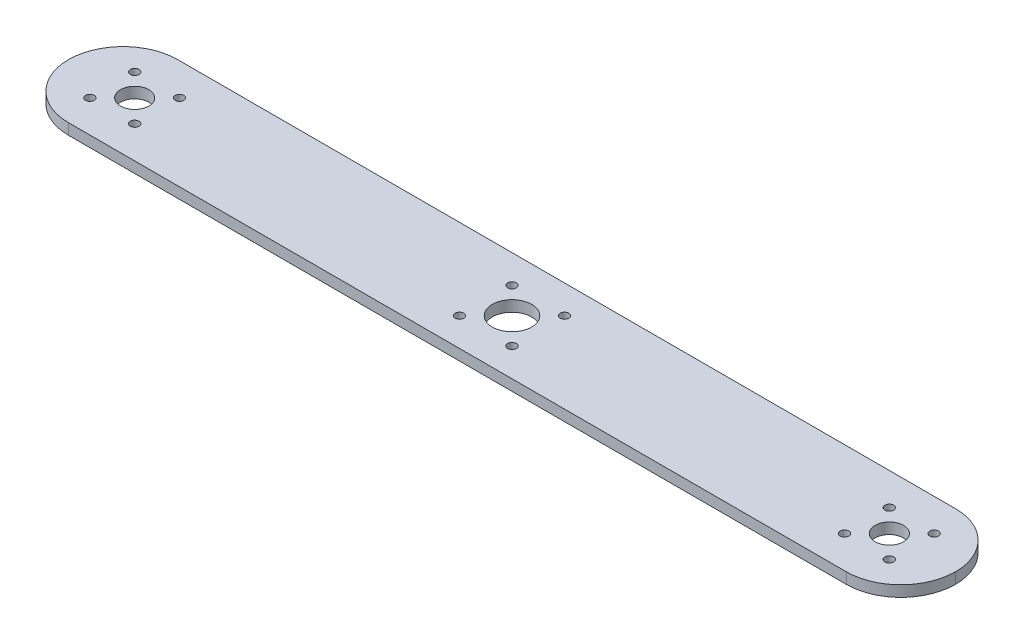
ISO-10303-21;
HEADER;
FILE_DESCRIPTION(('STEP AP214'),'2;1');
FILE_NAME('part.step','',(''),(''),'','','');
FILE_SCHEMA(('AUTOMOTIVE_DESIGN { 1 0 10303 214 1 1 1 1 }'));
ENDSEC;
DATA;
#1=APPLICATION_CONTEXT('core data for automotive mechanical design processes');
#2=APPLICATION_PROTOCOL_DEFINITION('international standard','automotive_design',2000,#1);
#3=PRODUCT_CONTEXT('',#1,'mechanical');
#4=PRODUCT('Part','Part','',(#3));
#5=PRODUCT_RELATED_PRODUCT_CATEGORY('part','',(#4));
#6=PRODUCT_DEFINITION_FORMATION('','',#4);
#7=PRODUCT_DEFINITION_CONTEXT('part definition',#1,'design');
#8=PRODUCT_DEFINITION('design','',#6,#7);
#9=PRODUCT_DEFINITION_SHAPE('','',#8);
#10=(LENGTH_UNIT() NAMED_UNIT(*) SI_UNIT(.MILLI.,.METRE.));
#11=(NAMED_UNIT(*) PLANE_ANGLE_UNIT() SI_UNIT($,.RADIAN.));
#12=(NAMED_UNIT(*) SI_UNIT($,.STERADIAN.) SOLID_ANGLE_UNIT());
#13=UNCERTAINTY_MEASURE_WITH_UNIT(LENGTH_MEASURE(1.E-05),#10,'distance_accuracy_value','');
#14=(GEOMETRIC_REPRESENTATION_CONTEXT(3) GLOBAL_UNCERTAINTY_ASSIGNED_CONTEXT((#13)) GLOBAL_UNIT_ASSIGNED_CONTEXT((#10,
#11,#12)) REPRESENTATION_CONTEXT('',''));
#15=CARTESIAN_POINT('',(0.,0.,0.));
#16=DIRECTION('',(0.,0.,1.));
#17=DIRECTION('',(1.,0.,0.));
#18=AXIS2_PLACEMENT_3D('',#15,#16,#17);
#19=CARTESIAN_POINT('',(0.,5.,-25.));
#20=DIRECTION('',(0.,0.,-1.));
#21=DIRECTION('',(-1.,0.,0.));
#22=AXIS2_PLACEMENT_3D('',#19,#20,#21);
#23=PLANE('',#22);
#24=DIRECTION('',(1.,0.,0.));
#25=VECTOR('',#24,1.);
#26=CARTESIAN_POINT('',(0.,0.,-25.));
#27=LINE('',#26,#25);
#28=CARTESIAN_POINT('',(-178.,0.,-25.));
#29=VERTEX_POINT('',#28);
#30=CARTESIAN_POINT('',(178.,0.,-25.));
#31=VERTEX_POINT('',#30);
#32=EDGE_CURVE('E102',#29,#31,#27,.T.);
#33=ORIENTED_EDGE('',*,*,#32,.F.);
#34=DIRECTION('',(0.,-1.,0.));
#35=VECTOR('',#34,1.);
#36=CARTESIAN_POINT('',(-178.,5.,-25.));
#37=LINE('',#36,#35);
#38=CARTESIAN_POINT('',(-178.,5.,-25.));
#39=VERTEX_POINT('',#38);
#40=EDGE_CURVE('E120',#29,#39,#37,.F.);
#41=ORIENTED_EDGE('',*,*,#40,.T.);
#42=DIRECTION('',(1.,0.,0.));
#43=VECTOR('',#42,1.);
#44=CARTESIAN_POINT('',(0.,5.,-25.));
#45=LINE('',#44,#43);
#46=CARTESIAN_POINT('',(178.,5.,-25.));
#47=VERTEX_POINT('',#46);
#48=EDGE_CURVE('E224',#39,#47,#45,.T.);
#49=ORIENTED_EDGE('',*,*,#48,.T.);
#50=DIRECTION('',(0.,-1.,0.));
#51=VECTOR('',#50,1.);
#52=CARTESIAN_POINT('',(178.,5.,-25.));
#53=LINE('',#52,#51);
#54=EDGE_CURVE('E118',#47,#31,#53,.T.);
#55=ORIENTED_EDGE('',*,*,#54,.T.);
#56=EDGE_LOOP('',(#33,#41,#49,#55));
#57=FACE_BOUND('',#56,.T.);
#58=ADVANCED_FACE('F37',(#57),#23,.T.);
#59=CARTESIAN_POINT('',(-182.953048327207,5.,10.2530483272039));
#60=DIRECTION('',(0.,-1.,0.));
#61=DIRECTION('',(0.,0.,-1.));
#62=AXIS2_PLACEMENT_3D('',#59,#60,#61);
#63=CYLINDRICAL_SURFACE('',#62,2.00000000000003);
#64=CARTESIAN_POINT('',(-182.953048327207,5.,10.2530483272039));
#65=DIRECTION('',(0.,1.,0.));
#66=DIRECTION('',(0.,0.,1.));
#67=AXIS2_PLACEMENT_3D('',#64,#65,#66);
#68=CIRCLE('',#67,2.00000000000003);
#69=CARTESIAN_POINT('',(-182.953048327207,5.,12.253048327204));
#70=VERTEX_POINT('',#69);
#71=EDGE_CURVE('E231',#70,#70,#68,.F.);
#72=ORIENTED_EDGE('',*,*,#71,.F.);
#73=EDGE_LOOP('',(#72));
#74=FACE_BOUND('',#73,.T.);
#75=CARTESIAN_POINT('',(-182.953048327207,0.,10.2530483272039));
#76=DIRECTION('',(0.,1.,0.));
#77=DIRECTION('',(0.,0.,1.));
#78=AXIS2_PLACEMENT_3D('',#75,#76,#77);
#79=CIRCLE('',#78,2.00000000000003);
#80=CARTESIAN_POINT('',(-182.953048327207,0.,12.253048327204));
#81=VERTEX_POINT('',#80);
#82=EDGE_CURVE('E179',#81,#81,#79,.F.);
#83=ORIENTED_EDGE('',*,*,#82,.T.);
#84=EDGE_LOOP('',(#83));
#85=FACE_BOUND('',#84,.T.);
#86=ADVANCED_FACE('F255',(#74,#85),#63,.F.);
#87=CARTESIAN_POINT('',(182.953048327205,5.,-10.2530483272058));
#88=DIRECTION('',(0.,-1.,0.));
#89=DIRECTION('',(0.,0.,-1.));
#90=AXIS2_PLACEMENT_3D('',#87,#88,#89);
#91=CYLINDRICAL_SURFACE('',#90,2.);
#92=CARTESIAN_POINT('',(182.953048327205,5.,-10.2530483272058));
#93=DIRECTION('',(0.,1.,0.));
#94=DIRECTION('',(0.,0.,1.));
#95=AXIS2_PLACEMENT_3D('',#92,#93,#94);
#96=CIRCLE('',#95,2.);
#97=CARTESIAN_POINT('',(182.953048327205,5.,-8.25304832720582));
#98=VERTEX_POINT('',#97);
#99=EDGE_CURVE('E229',#98,#98,#96,.T.);
#100=ORIENTED_EDGE('',*,*,#99,.T.);
#101=EDGE_LOOP('',(#100));
#102=FACE_BOUND('',#101,.T.);
#103=CARTESIAN_POINT('',(182.953048327205,0.,-10.2530483272058));
#104=DIRECTION('',(0.,1.,0.));
#105=DIRECTION('',(0.,0.,1.));
#106=AXIS2_PLACEMENT_3D('',#103,#104,#105);
#107=CIRCLE('',#106,2.);
#108=CARTESIAN_POINT('',(182.953048327205,0.,-8.25304832720582));
#109=VERTEX_POINT('',#108);
#110=EDGE_CURVE('E176',#109,#109,#107,.T.);
#111=ORIENTED_EDGE('',*,*,#110,.F.);
#112=EDGE_LOOP('',(#111));
#113=FACE_BOUND('',#112,.T.);
#114=ADVANCED_FACE('F261',(#102,#113),#91,.F.);
#115=CARTESIAN_POINT('',(0.,5.,25.));
#116=DIRECTION('',(0.,0.,-1.));
#117=DIRECTION('',(-1.,0.,0.));
#118=AXIS2_PLACEMENT_3D('',#115,#116,#117);
#119=PLANE('',#118);
#120=DIRECTION('',(1.,0.,0.));
#121=VECTOR('',#120,1.);
#122=CARTESIAN_POINT('',(0.,5.,25.));
#123=LINE('',#122,#121);
#124=CARTESIAN_POINT('',(-178.,5.,25.));
#125=VERTEX_POINT('',#124);
#126=CARTESIAN_POINT('',(178.,5.,25.));
#127=VERTEX_POINT('',#126);
#128=EDGE_CURVE('E227',#125,#127,#123,.T.);
#129=ORIENTED_EDGE('',*,*,#128,.F.);
#130=DIRECTION('',(0.,-1.,0.));
#131=VECTOR('',#130,1.);
#132=CARTESIAN_POINT('',(-178.,5.,25.));
#133=LINE('',#132,#131);
#134=CARTESIAN_POINT('',(-178.,0.,25.));
#135=VERTEX_POINT('',#134);
#136=EDGE_CURVE('E11',#125,#135,#133,.T.);
#137=ORIENTED_EDGE('',*,*,#136,.T.);
#138=DIRECTION('',(1.,0.,0.));
#139=VECTOR('',#138,1.);
#140=CARTESIAN_POINT('',(0.,0.,25.));
#141=LINE('',#140,#139);
#142=CARTESIAN_POINT('',(178.,0.,25.));
#143=VERTEX_POINT('',#142);
#144=EDGE_CURVE('E174',#135,#143,#141,.T.);
#145=ORIENTED_EDGE('',*,*,#144,.T.);
#146=DIRECTION('',(0.,-1.,0.));
#147=VECTOR('',#146,1.);
#148=CARTESIAN_POINT('',(178.,5.,25.));
#149=LINE('',#148,#147);
#150=EDGE_CURVE('E46',#143,#127,#149,.F.);
#151=ORIENTED_EDGE('',*,*,#150,.T.);
#152=EDGE_LOOP('',(#129,#137,#145,#151));
#153=FACE_BOUND('',#152,.T.);
#154=ADVANCED_FACE('F265',(#153),#119,.F.);
#155=CARTESIAN_POINT('',(12.0208152801712,5.,-12.0208152801715));
#156=DIRECTION('',(0.,-1.,0.));
#157=DIRECTION('',(0.,0.,-1.));
#158=AXIS2_PLACEMENT_3D('',#155,#156,#157);
#159=CYLINDRICAL_SURFACE('',#158,2.);
#160=CARTESIAN_POINT('',(12.0208152801712,5.,-12.0208152801715));
#161=DIRECTION('',(0.,1.,0.));
#162=DIRECTION('',(0.,0.,1.));
#163=AXIS2_PLACEMENT_3D('',#160,#161,#162);
#164=CIRCLE('',#163,2.);
#165=CARTESIAN_POINT('',(12.0208152801712,5.,-10.0208152801715));
#166=VERTEX_POINT('',#165);
#167=EDGE_CURVE('E221',#166,#166,#164,.T.);
#168=ORIENTED_EDGE('',*,*,#167,.T.);
#169=EDGE_LOOP('',(#168));
#170=FACE_BOUND('',#169,.T.);
#171=CARTESIAN_POINT('',(12.0208152801712,0.,-12.0208152801715));
#172=DIRECTION('',(0.,1.,0.));
#173=DIRECTION('',(0.,0.,1.));
#174=AXIS2_PLACEMENT_3D('',#171,#172,#173);
#175=CIRCLE('',#174,2.);
#176=CARTESIAN_POINT('',(12.0208152801712,0.,-10.0208152801715));
#177=VERTEX_POINT('',#176);
#178=EDGE_CURVE('E170',#177,#177,#175,.T.);
#179=ORIENTED_EDGE('',*,*,#178,.F.);
#180=EDGE_LOOP('',(#179));
#181=FACE_BOUND('',#180,.T.);
#182=ADVANCED_FACE('F267',(#170,#181),#159,.F.);
#183=CARTESIAN_POINT('',(12.0208152801716,5.,12.020815280171));
#184=DIRECTION('',(0.,-1.,0.));
#185=DIRECTION('',(0.,0.,-1.));
#186=AXIS2_PLACEMENT_3D('',#183,#184,#185);
#187=CYLINDRICAL_SURFACE('',#186,2.);
#188=CARTESIAN_POINT('',(12.0208152801716,5.,12.020815280171));
#189=DIRECTION('',(0.,1.,0.));
#190=DIRECTION('',(0.,0.,1.));
#191=AXIS2_PLACEMENT_3D('',#188,#189,#190);
#192=CIRCLE('',#191,2.);
#193=CARTESIAN_POINT('',(12.0208152801716,5.,14.020815280171));
#194=VERTEX_POINT('',#193);
#195=EDGE_CURVE('E218',#194,#194,#192,.T.);
#196=ORIENTED_EDGE('',*,*,#195,.T.);
#197=EDGE_LOOP('',(#196));
#198=FACE_BOUND('',#197,.T.);
#199=CARTESIAN_POINT('',(12.0208152801716,0.,12.020815280171));
#200=DIRECTION('',(0.,1.,0.));
#201=DIRECTION('',(0.,0.,1.));
#202=AXIS2_PLACEMENT_3D('',#199,#200,#201);
#203=CIRCLE('',#202,2.);
#204=CARTESIAN_POINT('',(12.0208152801716,0.,14.020815280171));
#205=VERTEX_POINT('',#204);
#206=EDGE_CURVE('E167',#205,#205,#203,.T.);
#207=ORIENTED_EDGE('',*,*,#206,.F.);
#208=EDGE_LOOP('',(#207));
#209=FACE_BOUND('',#208,.T.);
#210=ADVANCED_FACE('F270',(#198,#209),#187,.F.);
#211=CARTESIAN_POINT('',(-182.953048327205,5.,-10.2530483272058));
#212=DIRECTION('',(0.,-1.,0.));
#213=DIRECTION('',(0.,0.,-1.));
#214=AXIS2_PLACEMENT_3D('',#211,#212,#213);
#215=CYLINDRICAL_SURFACE('',#214,2.);
#216=CARTESIAN_POINT('',(-182.953048327205,5.,-10.2530483272058));
#217=DIRECTION('',(0.,1.,0.));
#218=DIRECTION('',(0.,0.,1.));
#219=AXIS2_PLACEMENT_3D('',#216,#217,#218);
#220=CIRCLE('',#219,2.);
#221=CARTESIAN_POINT('',(-182.953048327205,5.,-8.25304832720582));
#222=VERTEX_POINT('',#221);
#223=EDGE_CURVE('E215',#222,#222,#220,.F.);
#224=ORIENTED_EDGE('',*,*,#223,.F.);
#225=EDGE_LOOP('',(#224));
#226=FACE_BOUND('',#225,.T.);
#227=CARTESIAN_POINT('',(-182.953048327205,0.,-10.2530483272058));
#228=DIRECTION('',(0.,1.,0.));
#229=DIRECTION('',(0.,0.,1.));
#230=AXIS2_PLACEMENT_3D('',#227,#228,#229);
#231=CIRCLE('',#230,2.);
#232=CARTESIAN_POINT('',(-182.953048327205,0.,-8.25304832720582));
#233=VERTEX_POINT('',#232);
#234=EDGE_CURVE('E164',#233,#233,#231,.F.);
#235=ORIENTED_EDGE('',*,*,#234,.T.);
#236=EDGE_LOOP('',(#235));
#237=FACE_BOUND('',#236,.T.);
#238=ADVANCED_FACE('F274',(#226,#237),#215,.F.);
#239=CARTESIAN_POINT('',(182.953048327207,5.,10.2530483272039));
#240=DIRECTION('',(0.,-1.,0.));
#241=DIRECTION('',(0.,0.,-1.));
#242=AXIS2_PLACEMENT_3D('',#239,#240,#241);
#243=CYLINDRICAL_SURFACE('',#242,2.00000000000003);
#244=CARTESIAN_POINT('',(182.953048327207,5.,10.2530483272039));
#245=DIRECTION('',(0.,1.,0.));
#246=DIRECTION('',(0.,0.,1.));
#247=AXIS2_PLACEMENT_3D('',#244,#245,#246);
#248=CIRCLE('',#247,2.00000000000003);
#249=CARTESIAN_POINT('',(182.953048327207,5.,12.253048327204));
#250=VERTEX_POINT('',#249);
#251=EDGE_CURVE('E212',#250,#250,#248,.T.);
#252=ORIENTED_EDGE('',*,*,#251,.T.);
#253=EDGE_LOOP('',(#252));
#254=FACE_BOUND('',#253,.T.);
#255=CARTESIAN_POINT('',(182.953048327207,0.,10.2530483272039));
#256=DIRECTION('',(0.,1.,0.));
#257=DIRECTION('',(0.,0.,1.));
#258=AXIS2_PLACEMENT_3D('',#255,#256,#257);
#259=CIRCLE('',#258,2.00000000000003);
#260=CARTESIAN_POINT('',(182.953048327207,0.,12.253048327204));
#261=VERTEX_POINT('',#260);
#262=EDGE_CURVE('E161',#261,#261,#259,.T.);
#263=ORIENTED_EDGE('',*,*,#262,.F.);
#264=EDGE_LOOP('',(#263));
#265=FACE_BOUND('',#264,.T.);
#266=ADVANCED_FACE('F278',(#254,#265),#243,.F.);
#267=CARTESIAN_POINT('',(-162.446951672797,5.,10.2530483272057));
#268=DIRECTION('',(0.,-1.,0.));
#269=DIRECTION('',(0.,0.,-1.));
#270=AXIS2_PLACEMENT_3D('',#267,#268,#269);
#271=CYLINDRICAL_SURFACE('',#270,2.);
#272=CARTESIAN_POINT('',(-162.446951672797,5.,10.2530483272057));
#273=DIRECTION('',(0.,1.,0.));
#274=DIRECTION('',(0.,0.,1.));
#275=AXIS2_PLACEMENT_3D('',#272,#273,#274);
#276=CIRCLE('',#275,2.);
#277=CARTESIAN_POINT('',(-162.446951672797,5.,12.2530483272057));
#278=VERTEX_POINT('',#277);
#279=EDGE_CURVE('E209',#278,#278,#276,.F.);
#280=ORIENTED_EDGE('',*,*,#279,.F.);
#281=EDGE_LOOP('',(#280));
#282=FACE_BOUND('',#281,.T.);
#283=CARTESIAN_POINT('',(-162.446951672797,0.,10.2530483272057));
#284=DIRECTION('',(0.,1.,0.));
#285=DIRECTION('',(0.,0.,1.));
#286=AXIS2_PLACEMENT_3D('',#283,#284,#285);
#287=CIRCLE('',#286,2.);
#288=CARTESIAN_POINT('',(-162.446951672797,0.,12.2530483272057));
#289=VERTEX_POINT('',#288);
#290=EDGE_CURVE('E158',#289,#289,#287,.F.);
#291=ORIENTED_EDGE('',*,*,#290,.T.);
#292=EDGE_LOOP('',(#291));
#293=FACE_BOUND('',#292,.T.);
#294=ADVANCED_FACE('F282',(#282,#293),#271,.F.);
#295=CARTESIAN_POINT('',(-12.0208152801714,5.,12.0208152801712));
#296=DIRECTION('',(0.,-1.,0.));
#297=DIRECTION('',(0.,0.,-1.));
#298=AXIS2_PLACEMENT_3D('',#295,#296,#297);
#299=CYLINDRICAL_SURFACE('',#298,2.);
#300=CARTESIAN_POINT('',(-12.0208152801714,5.,12.0208152801712));
#301=DIRECTION('',(0.,1.,0.));
#302=DIRECTION('',(0.,0.,1.));
#303=AXIS2_PLACEMENT_3D('',#300,#301,#302);
#304=CIRCLE('',#303,2.);
#305=CARTESIAN_POINT('',(-12.0208152801714,5.,14.0208152801712));
#306=VERTEX_POINT('',#305);
#307=EDGE_CURVE('E206',#306,#306,#304,.T.);
#308=ORIENTED_EDGE('',*,*,#307,.T.);
#309=EDGE_LOOP('',(#308));
#310=FACE_BOUND('',#309,.T.);
#311=CARTESIAN_POINT('',(-12.0208152801714,0.,12.0208152801712));
#312=DIRECTION('',(0.,1.,0.));
#313=DIRECTION('',(0.,0.,1.));
#314=AXIS2_PLACEMENT_3D('',#311,#312,#313);
#315=CIRCLE('',#314,2.);
#316=CARTESIAN_POINT('',(-12.0208152801714,0.,14.0208152801712));
#317=VERTEX_POINT('',#316);
#318=EDGE_CURVE('E155',#317,#317,#315,.T.);
#319=ORIENTED_EDGE('',*,*,#318,.F.);
#320=EDGE_LOOP('',(#319));
#321=FACE_BOUND('',#320,.T.);
#322=ADVANCED_FACE('F286',(#310,#321),#299,.F.);
#323=CARTESIAN_POINT('',(162.446951672797,5.,10.2530483272057));
#324=DIRECTION('',(0.,-1.,0.));
#325=DIRECTION('',(0.,0.,-1.));
#326=AXIS2_PLACEMENT_3D('',#323,#324,#325);
#327=CYLINDRICAL_SURFACE('',#326,2.);
#328=CARTESIAN_POINT('',(162.446951672797,5.,10.2530483272057));
#329=DIRECTION('',(0.,1.,0.));
#330=DIRECTION('',(0.,0.,1.));
#331=AXIS2_PLACEMENT_3D('',#328,#329,#330);
#332=CIRCLE('',#331,2.);
#333=CARTESIAN_POINT('',(162.446951672797,5.,12.2530483272057));
#334=VERTEX_POINT('',#333);
#335=EDGE_CURVE('E203',#334,#334,#332,.T.);
#336=ORIENTED_EDGE('',*,*,#335,.T.);
#337=EDGE_LOOP('',(#336));
#338=FACE_BOUND('',#337,.T.);
#339=CARTESIAN_POINT('',(162.446951672797,0.,10.2530483272057));
#340=DIRECTION('',(0.,1.,0.));
#341=DIRECTION('',(0.,0.,1.));
#342=AXIS2_PLACEMENT_3D('',#339,#340,#341);
#343=CIRCLE('',#342,2.);
#344=CARTESIAN_POINT('',(162.446951672797,0.,12.2530483272057));
#345=VERTEX_POINT('',#344);
#346=EDGE_CURVE('E152',#345,#345,#343,.T.);
#347=ORIENTED_EDGE('',*,*,#346,.F.);
#348=EDGE_LOOP('',(#347));
#349=FACE_BOUND('',#348,.T.);
#350=ADVANCED_FACE('F290',(#338,#349),#327,.F.);
#351=CARTESIAN_POINT('',(-12.0208152801712,5.,-12.0208152801714));
#352=DIRECTION('',(0.,-1.,0.));
#353=DIRECTION('',(0.,0.,-1.));
#354=AXIS2_PLACEMENT_3D('',#351,#352,#353);
#355=CYLINDRICAL_SURFACE('',#354,2.);
#356=CARTESIAN_POINT('',(-12.0208152801712,5.,-12.0208152801714));
#357=DIRECTION('',(0.,1.,0.));
#358=DIRECTION('',(0.,0.,1.));
#359=AXIS2_PLACEMENT_3D('',#356,#357,#358);
#360=CIRCLE('',#359,2.);
#361=CARTESIAN_POINT('',(-12.0208152801712,5.,-10.0208152801714));
#362=VERTEX_POINT('',#361);
#363=EDGE_CURVE('E200',#362,#362,#360,.T.);
#364=ORIENTED_EDGE('',*,*,#363,.T.);
#365=EDGE_LOOP('',(#364));
#366=FACE_BOUND('',#365,.T.);
#367=CARTESIAN_POINT('',(-12.0208152801712,0.,-12.0208152801714));
#368=DIRECTION('',(0.,1.,0.));
#369=DIRECTION('',(0.,0.,1.));
#370=AXIS2_PLACEMENT_3D('',#367,#368,#369);
#371=CIRCLE('',#370,2.);
#372=CARTESIAN_POINT('',(-12.0208152801712,0.,-10.0208152801714));
#373=VERTEX_POINT('',#372);
#374=EDGE_CURVE('E149',#373,#373,#371,.T.);
#375=ORIENTED_EDGE('',*,*,#374,.F.);
#376=EDGE_LOOP('',(#375));
#377=FACE_BOUND('',#376,.T.);
#378=ADVANCED_FACE('F294',(#366,#377),#355,.F.);
#379=CARTESIAN_POINT('',(162.446951672796,5.,-10.2530483272041));
#380=DIRECTION('',(0.,-1.,0.));
#381=DIRECTION('',(0.,0.,-1.));
#382=AXIS2_PLACEMENT_3D('',#379,#380,#381);
#383=CYLINDRICAL_SURFACE('',#382,2.);
#384=CARTESIAN_POINT('',(162.446951672796,5.,-10.2530483272041));
#385=DIRECTION('',(0.,1.,0.));
#386=DIRECTION('',(0.,0.,1.));
#387=AXIS2_PLACEMENT_3D('',#384,#385,#386);
#388=CIRCLE('',#387,2.);
#389=CARTESIAN_POINT('',(162.446951672796,5.,-8.25304832720412));
#390=VERTEX_POINT('',#389);
#391=EDGE_CURVE('E197',#390,#390,#388,.T.);
#392=ORIENTED_EDGE('',*,*,#391,.T.);
#393=EDGE_LOOP('',(#392));
#394=FACE_BOUND('',#393,.T.);
#395=CARTESIAN_POINT('',(162.446951672796,0.,-10.2530483272041));
#396=DIRECTION('',(0.,1.,0.));
#397=DIRECTION('',(0.,0.,1.));
#398=AXIS2_PLACEMENT_3D('',#395,#396,#397);
#399=CIRCLE('',#398,2.);
#400=CARTESIAN_POINT('',(162.446951672796,0.,-8.25304832720412));
#401=VERTEX_POINT('',#400);
#402=EDGE_CURVE('E146',#401,#401,#399,.T.);
#403=ORIENTED_EDGE('',*,*,#402,.F.);
#404=EDGE_LOOP('',(#403));
#405=FACE_BOUND('',#404,.T.);
#406=ADVANCED_FACE('F298',(#394,#405),#383,.F.);
#407=CARTESIAN_POINT('',(-172.7,5.,0.));
#408=DIRECTION('',(0.,-1.,0.));
#409=DIRECTION('',(0.,0.,-1.));
#410=AXIS2_PLACEMENT_3D('',#407,#408,#409);
#411=CYLINDRICAL_SURFACE('',#410,6.50000000000003);
#412=CARTESIAN_POINT('',(-172.7,5.,0.));
#413=DIRECTION('',(0.,1.,0.));
#414=DIRECTION('',(0.,0.,1.));
#415=AXIS2_PLACEMENT_3D('',#412,#413,#414);
#416=CIRCLE('',#415,6.50000000000003);
#417=CARTESIAN_POINT('',(-172.7,5.,6.50000000000003));
#418=VERTEX_POINT('',#417);
#419=EDGE_CURVE('E192',#418,#418,#416,.F.);
#420=ORIENTED_EDGE('',*,*,#419,.F.);
#421=EDGE_LOOP('',(#420));
#422=FACE_BOUND('',#421,.T.);
#423=CARTESIAN_POINT('',(-172.7,0.,0.));
#424=DIRECTION('',(0.,1.,0.));
#425=DIRECTION('',(0.,0.,1.));
#426=AXIS2_PLACEMENT_3D('',#423,#424,#425);
#427=CIRCLE('',#426,6.50000000000003);
#428=CARTESIAN_POINT('',(-172.7,0.,6.50000000000003));
#429=VERTEX_POINT('',#428);
#430=EDGE_CURVE('E139',#429,#429,#427,.F.);
#431=ORIENTED_EDGE('',*,*,#430,.T.);
#432=EDGE_LOOP('',(#431));
#433=FACE_BOUND('',#432,.T.);
#434=ADVANCED_FACE('F302',(#422,#433),#411,.F.);
#435=CARTESIAN_POINT('',(172.7,5.,0.));
#436=DIRECTION('',(0.,-1.,0.));
#437=DIRECTION('',(0.,0.,-1.));
#438=AXIS2_PLACEMENT_3D('',#435,#436,#437);
#439=CYLINDRICAL_SURFACE('',#438,6.50000000000002);
#440=CARTESIAN_POINT('',(172.7,5.,0.));
#441=DIRECTION('',(0.,1.,0.));
#442=DIRECTION('',(0.,0.,1.));
#443=AXIS2_PLACEMENT_3D('',#440,#441,#442);
#444=CIRCLE('',#443,6.50000000000002);
#445=CARTESIAN_POINT('',(172.7,5.,6.49999999999995));
#446=VERTEX_POINT('',#445);
#447=EDGE_CURVE('E187',#446,#446,#444,.T.);
#448=ORIENTED_EDGE('',*,*,#447,.T.);
#449=EDGE_LOOP('',(#448));
#450=FACE_BOUND('',#449,.T.);
#451=CARTESIAN_POINT('',(172.7,0.,0.));
#452=DIRECTION('',(0.,1.,0.));
#453=DIRECTION('',(0.,0.,1.));
#454=AXIS2_PLACEMENT_3D('',#451,#452,#453);
#455=CIRCLE('',#454,6.50000000000002);
#456=CARTESIAN_POINT('',(172.7,0.,6.49999999999995));
#457=VERTEX_POINT('',#456);
#458=EDGE_CURVE('E134',#457,#457,#455,.T.);
#459=ORIENTED_EDGE('',*,*,#458,.F.);
#460=EDGE_LOOP('',(#459));
#461=FACE_BOUND('',#460,.T.);
#462=ADVANCED_FACE('F250',(#450,#461),#439,.F.);
#463=CARTESIAN_POINT('',(0.,5.,0.));
#464=DIRECTION('',(0.,-1.,0.));
#465=DIRECTION('',(0.,0.,-1.));
#466=AXIS2_PLACEMENT_3D('',#463,#464,#465);
#467=CYLINDRICAL_SURFACE('',#466,9.);
#468=CARTESIAN_POINT('',(0.,5.,0.));
#469=DIRECTION('',(0.,1.,0.));
#470=DIRECTION('',(0.,0.,1.));
#471=AXIS2_PLACEMENT_3D('',#468,#469,#470);
#472=CIRCLE('',#471,9.);
#473=CARTESIAN_POINT('',(0.,5.,8.99999999999997));
#474=VERTEX_POINT('',#473);
#475=EDGE_CURVE('E183',#474,#474,#472,.T.);
#476=ORIENTED_EDGE('',*,*,#475,.T.);
#477=EDGE_LOOP('',(#476));
#478=FACE_BOUND('',#477,.T.);
#479=CARTESIAN_POINT('',(0.,0.,0.));
#480=DIRECTION('',(0.,1.,0.));
#481=DIRECTION('',(0.,0.,1.));
#482=AXIS2_PLACEMENT_3D('',#479,#480,#481);
#483=CIRCLE('',#482,9.);
#484=CARTESIAN_POINT('',(0.,0.,8.99999999999997));
#485=VERTEX_POINT('',#484);
#486=EDGE_CURVE('E129',#485,#485,#483,.T.);
#487=ORIENTED_EDGE('',*,*,#486,.F.);
#488=EDGE_LOOP('',(#487));
#489=FACE_BOUND('',#488,.T.);
#490=ADVANCED_FACE('F242',(#478,#489),#467,.F.);
#491=CARTESIAN_POINT('',(-162.446951672796,5.,-10.2530483272041));
#492=DIRECTION('',(0.,-1.,0.));
#493=DIRECTION('',(0.,0.,-1.));
#494=AXIS2_PLACEMENT_3D('',#491,#492,#493);
#495=CYLINDRICAL_SURFACE('',#494,2.);
#496=CARTESIAN_POINT('',(-162.446951672796,5.,-10.2530483272041));
#497=DIRECTION('',(0.,1.,0.));
#498=DIRECTION('',(0.,0.,1.));
#499=AXIS2_PLACEMENT_3D('',#496,#497,#498);
#500=CIRCLE('',#499,2.);
#501=CARTESIAN_POINT('',(-162.446951672796,5.,-8.25304832720412));
#502=VERTEX_POINT('',#501);
#503=EDGE_CURVE('E105',#502,#502,#500,.F.);
#504=ORIENTED_EDGE('',*,*,#503,.F.);
#505=EDGE_LOOP('',(#504));
#506=FACE_BOUND('',#505,.T.);
#507=CARTESIAN_POINT('',(-162.446951672796,0.,-10.2530483272041));
#508=DIRECTION('',(0.,1.,0.));
#509=DIRECTION('',(0.,0.,1.));
#510=AXIS2_PLACEMENT_3D('',#507,#508,#509);
#511=CIRCLE('',#510,2.);
#512=CARTESIAN_POINT('',(-162.446951672796,0.,-8.25304832720412));
#513=VERTEX_POINT('',#512);
#514=EDGE_CURVE('E181',#513,#513,#511,.F.);
#515=ORIENTED_EDGE('',*,*,#514,.T.);
#516=EDGE_LOOP('',(#515));
#517=FACE_BOUND('',#516,.T.);
#518=ADVANCED_FACE('F240',(#506,#517),#495,.F.);
#519=CARTESIAN_POINT('',(0.,5.,0.));
#520=DIRECTION('',(0.,1.,0.));
#521=DIRECTION('',(0.,0.,1.));
#522=AXIS2_PLACEMENT_3D('',#519,#520,#521);
#523=PLANE('',#522);
#524=ORIENTED_EDGE('',*,*,#475,.F.);
#525=EDGE_LOOP('',(#524));
#526=FACE_BOUND('',#525,.T.);
#527=ORIENTED_EDGE('',*,*,#447,.F.);
#528=EDGE_LOOP('',(#527));
#529=FACE_BOUND('',#528,.T.);
#530=ORIENTED_EDGE('',*,*,#419,.T.);
#531=EDGE_LOOP('',(#530));
#532=FACE_BOUND('',#531,.T.);
#533=ORIENTED_EDGE('',*,*,#391,.F.);
#534=EDGE_LOOP('',(#533));
#535=FACE_BOUND('',#534,.T.);
#536=ORIENTED_EDGE('',*,*,#363,.F.);
#537=EDGE_LOOP('',(#536));
#538=FACE_BOUND('',#537,.T.);
#539=ORIENTED_EDGE('',*,*,#335,.F.);
#540=EDGE_LOOP('',(#539));
#541=FACE_BOUND('',#540,.T.);
#542=ORIENTED_EDGE('',*,*,#307,.F.);
#543=EDGE_LOOP('',(#542));
#544=FACE_BOUND('',#543,.T.);
#545=ORIENTED_EDGE('',*,*,#279,.T.);
#546=EDGE_LOOP('',(#545));
#547=FACE_BOUND('',#546,.T.);
#548=ORIENTED_EDGE('',*,*,#251,.F.);
#549=EDGE_LOOP('',(#548));
#550=FACE_BOUND('',#549,.T.);
#551=ORIENTED_EDGE('',*,*,#223,.T.);
#552=EDGE_LOOP('',(#551));
#553=FACE_BOUND('',#552,.T.);
#554=ORIENTED_EDGE('',*,*,#195,.F.);
#555=EDGE_LOOP('',(#554));
#556=FACE_BOUND('',#555,.T.);
#557=ORIENTED_EDGE('',*,*,#167,.F.);
#558=EDGE_LOOP('',(#557));
#559=FACE_BOUND('',#558,.T.);
#560=ORIENTED_EDGE('',*,*,#48,.F.);
#561=CARTESIAN_POINT('',(-178.,5.,0.));
#562=DIRECTION('',(0.,1.,0.));
#563=DIRECTION('',(0.,0.,1.));
#564=AXIS2_PLACEMENT_3D('',#561,#562,#563);
#565=CIRCLE('',#564,25.);
#566=CARTESIAN_POINT('',(-203.,5.,0.));
#567=VERTEX_POINT('',#566);
#568=EDGE_CURVE('E126',#39,#567,#565,.T.);
#569=ORIENTED_EDGE('',*,*,#568,.T.);
#570=CARTESIAN_POINT('',(-178.,5.,0.));
#571=DIRECTION('',(0.,1.,0.));
#572=DIRECTION('',(0.,0.,1.));
#573=AXIS2_PLACEMENT_3D('',#570,#571,#572);
#574=CIRCLE('',#573,25.);
#575=EDGE_CURVE('E62',#567,#125,#574,.T.);
#576=ORIENTED_EDGE('',*,*,#575,.T.);
#577=ORIENTED_EDGE('',*,*,#128,.T.);
#578=CARTESIAN_POINT('',(178.,5.,0.));
#579=DIRECTION('',(0.,1.,0.));
#580=DIRECTION('',(0.,0.,1.));
#581=AXIS2_PLACEMENT_3D('',#578,#579,#580);
#582=CIRCLE('',#581,25.);
#583=CARTESIAN_POINT('',(203.,5.,0.));
#584=VERTEX_POINT('',#583);
#585=EDGE_CURVE('E54',#127,#584,#582,.T.);
#586=ORIENTED_EDGE('',*,*,#585,.T.);
#587=CARTESIAN_POINT('',(178.,5.,0.));
#588=DIRECTION('',(0.,1.,0.));
#589=DIRECTION('',(0.,0.,1.));
#590=AXIS2_PLACEMENT_3D('',#587,#588,#589);
#591=CIRCLE('',#590,25.);
#592=EDGE_CURVE('E108',#584,#47,#591,.T.);
#593=ORIENTED_EDGE('',*,*,#592,.T.);
#594=EDGE_LOOP('',(#560,#569,#576,#577,#586,#593));
#595=FACE_BOUND('',#594,.T.);
#596=ORIENTED_EDGE('',*,*,#99,.F.);
#597=EDGE_LOOP('',(#596));
#598=FACE_BOUND('',#597,.T.);
#599=ORIENTED_EDGE('',*,*,#71,.T.);
#600=EDGE_LOOP('',(#599));
#601=FACE_BOUND('',#600,.T.);
#602=ORIENTED_EDGE('',*,*,#503,.T.);
#603=EDGE_LOOP('',(#602));
#604=FACE_BOUND('',#603,.T.);
#605=ADVANCED_FACE('F238',(#526,#529,#532,#535,#538,#541,#544,#547,#550,#553,#556,#559,#595,
#598,#601,#604),#523,.T.);
#606=CARTESIAN_POINT('',(0.,0.,0.));
#607=DIRECTION('',(0.,1.,0.));
#608=DIRECTION('',(0.,0.,1.));
#609=AXIS2_PLACEMENT_3D('',#606,#607,#608);
#610=PLANE('',#609);
#611=ORIENTED_EDGE('',*,*,#486,.T.);
#612=EDGE_LOOP('',(#611));
#613=FACE_BOUND('',#612,.T.);
#614=ORIENTED_EDGE('',*,*,#458,.T.);
#615=EDGE_LOOP('',(#614));
#616=FACE_BOUND('',#615,.T.);
#617=ORIENTED_EDGE('',*,*,#430,.F.);
#618=EDGE_LOOP('',(#617));
#619=FACE_BOUND('',#618,.T.);
#620=ORIENTED_EDGE('',*,*,#402,.T.);
#621=EDGE_LOOP('',(#620));
#622=FACE_BOUND('',#621,.T.);
#623=ORIENTED_EDGE('',*,*,#374,.T.);
#624=EDGE_LOOP('',(#623));
#625=FACE_BOUND('',#624,.T.);
#626=ORIENTED_EDGE('',*,*,#346,.T.);
#627=EDGE_LOOP('',(#626));
#628=FACE_BOUND('',#627,.T.);
#629=ORIENTED_EDGE('',*,*,#318,.T.);
#630=EDGE_LOOP('',(#629));
#631=FACE_BOUND('',#630,.T.);
#632=ORIENTED_EDGE('',*,*,#290,.F.);
#633=EDGE_LOOP('',(#632));
#634=FACE_BOUND('',#633,.T.);
#635=ORIENTED_EDGE('',*,*,#262,.T.);
#636=EDGE_LOOP('',(#635));
#637=FACE_BOUND('',#636,.T.);
#638=ORIENTED_EDGE('',*,*,#234,.F.);
#639=EDGE_LOOP('',(#638));
#640=FACE_BOUND('',#639,.T.);
#641=ORIENTED_EDGE('',*,*,#206,.T.);
#642=EDGE_LOOP('',(#641));
#643=FACE_BOUND('',#642,.T.);
#644=ORIENTED_EDGE('',*,*,#178,.T.);
#645=EDGE_LOOP('',(#644));
#646=FACE_BOUND('',#645,.T.);
#647=CARTESIAN_POINT('',(-178.,0.,0.));
#648=DIRECTION('',(0.,1.,0.));
#649=DIRECTION('',(0.,0.,1.));
#650=AXIS2_PLACEMENT_3D('',#647,#648,#649);
#651=CIRCLE('',#650,25.);
#652=CARTESIAN_POINT('',(-203.,0.,0.));
#653=VERTEX_POINT('',#652);
#654=EDGE_CURVE('E111',#135,#653,#651,.F.);
#655=ORIENTED_EDGE('',*,*,#654,.T.);
#656=CARTESIAN_POINT('',(-178.,0.,0.));
#657=DIRECTION('',(0.,1.,0.));
#658=DIRECTION('',(0.,0.,1.));
#659=AXIS2_PLACEMENT_3D('',#656,#657,#658);
#660=CIRCLE('',#659,25.);
#661=EDGE_CURVE('E113',#653,#29,#660,.F.);
#662=ORIENTED_EDGE('',*,*,#661,.T.);
#663=ORIENTED_EDGE('',*,*,#32,.T.);
#664=CARTESIAN_POINT('',(178.,0.,0.));
#665=DIRECTION('',(0.,1.,0.));
#666=DIRECTION('',(0.,0.,1.));
#667=AXIS2_PLACEMENT_3D('',#664,#665,#666);
#668=CIRCLE('',#667,25.);
#669=CARTESIAN_POINT('',(203.,0.,0.));
#670=VERTEX_POINT('',#669);
#671=EDGE_CURVE('E93',#31,#670,#668,.F.);
#672=ORIENTED_EDGE('',*,*,#671,.T.);
#673=CARTESIAN_POINT('',(178.,0.,0.));
#674=DIRECTION('',(0.,1.,0.));
#675=DIRECTION('',(0.,0.,1.));
#676=AXIS2_PLACEMENT_3D('',#673,#674,#675);
#677=CIRCLE('',#676,25.);
#678=EDGE_CURVE('E99',#670,#143,#677,.F.);
#679=ORIENTED_EDGE('',*,*,#678,.T.);
#680=ORIENTED_EDGE('',*,*,#144,.F.);
#681=EDGE_LOOP('',(#655,#662,#663,#672,#679,#680));
#682=FACE_BOUND('',#681,.T.);
#683=ORIENTED_EDGE('',*,*,#110,.T.);
#684=EDGE_LOOP('',(#683));
#685=FACE_BOUND('',#684,.T.);
#686=ORIENTED_EDGE('',*,*,#82,.F.);
#687=EDGE_LOOP('',(#686));
#688=FACE_BOUND('',#687,.T.);
#689=ORIENTED_EDGE('',*,*,#514,.F.);
#690=EDGE_LOOP('',(#689));
#691=FACE_BOUND('',#690,.T.);
#692=ADVANCED_FACE('F95',(#613,#616,#619,#622,#625,#628,#631,#634,#637,#640,#643,#646,#682,#685,
#688,#691),#610,.F.);
#693=CARTESIAN_POINT('',(-178.,5.,0.));
#694=DIRECTION('',(0.,-1.,0.));
#695=DIRECTION('',(0.,0.,-1.));
#696=AXIS2_PLACEMENT_3D('',#693,#694,#695);
#697=CYLINDRICAL_SURFACE('',#696,25.);
#698=ORIENTED_EDGE('',*,*,#136,.F.);
#699=ORIENTED_EDGE('',*,*,#575,.F.);
#700=DIRECTION('',(0.,-1.,0.));
#701=VECTOR('',#700,1.);
#702=CARTESIAN_POINT('',(-203.,5.,0.));
#703=LINE('',#702,#701);
#704=EDGE_CURVE('E109',#653,#567,#703,.F.);
#705=ORIENTED_EDGE('',*,*,#704,.F.);
#706=ORIENTED_EDGE('',*,*,#654,.F.);
#707=EDGE_LOOP('',(#698,#699,#705,#706));
#708=FACE_BOUND('',#707,.T.);
#709=ADVANCED_FACE('F313',(#708),#697,.T.);
#710=CARTESIAN_POINT('',(-178.,5.,0.));
#711=DIRECTION('',(0.,1.,0.));
#712=DIRECTION('',(0.,0.,1.));
#713=AXIS2_PLACEMENT_3D('',#710,#711,#712);
#714=CYLINDRICAL_SURFACE('',#713,25.);
#715=ORIENTED_EDGE('',*,*,#568,.F.);
#716=ORIENTED_EDGE('',*,*,#40,.F.);
#717=ORIENTED_EDGE('',*,*,#661,.F.);
#718=ORIENTED_EDGE('',*,*,#704,.T.);
#719=EDGE_LOOP('',(#715,#716,#717,#718));
#720=FACE_BOUND('',#719,.T.);
#721=ADVANCED_FACE('F310',(#720),#714,.T.);
#722=CARTESIAN_POINT('',(178.,5.,0.));
#723=DIRECTION('',(0.,-1.,0.));
#724=DIRECTION('',(0.,0.,-1.));
#725=AXIS2_PLACEMENT_3D('',#722,#723,#724);
#726=CYLINDRICAL_SURFACE('',#725,25.);
#727=ORIENTED_EDGE('',*,*,#54,.F.);
#728=ORIENTED_EDGE('',*,*,#592,.F.);
#729=DIRECTION('',(0.,-1.,0.));
#730=VECTOR('',#729,1.);
#731=CARTESIAN_POINT('',(203.,5.,0.));
#732=LINE('',#731,#730);
#733=EDGE_CURVE('E41',#670,#584,#732,.F.);
#734=ORIENTED_EDGE('',*,*,#733,.F.);
#735=ORIENTED_EDGE('',*,*,#671,.F.);
#736=EDGE_LOOP('',(#727,#728,#734,#735));
#737=FACE_BOUND('',#736,.T.);
#738=ADVANCED_FACE('F39',(#737),#726,.T.);
#739=CARTESIAN_POINT('',(178.,5.,0.));
#740=DIRECTION('',(0.,1.,0.));
#741=DIRECTION('',(0.,0.,1.));
#742=AXIS2_PLACEMENT_3D('',#739,#740,#741);
#743=CYLINDRICAL_SURFACE('',#742,25.);
#744=ORIENTED_EDGE('',*,*,#585,.F.);
#745=ORIENTED_EDGE('',*,*,#150,.F.);
#746=ORIENTED_EDGE('',*,*,#678,.F.);
#747=ORIENTED_EDGE('',*,*,#733,.T.);
#748=EDGE_LOOP('',(#744,#745,#746,#747));
#749=FACE_BOUND('',#748,.T.);
#750=ADVANCED_FACE('F110',(#749),#743,.T.);
#751=CLOSED_SHELL('',(#58,#86,#114,#154,#182,#210,#238,#266,#294,#322,#350,#378,#406,#434,#462,
#490,#518,#605,#692,#709,#721,#738,#750));
#752=MANIFOLD_SOLID_BREP('B2',#751);
#753=ADVANCED_BREP_SHAPE_REPRESENTATION('',(#18,#752),#14);
#754=SHAPE_DEFINITION_REPRESENTATION(#9,#753);
ENDSEC;
END-ISO-10303-21;
